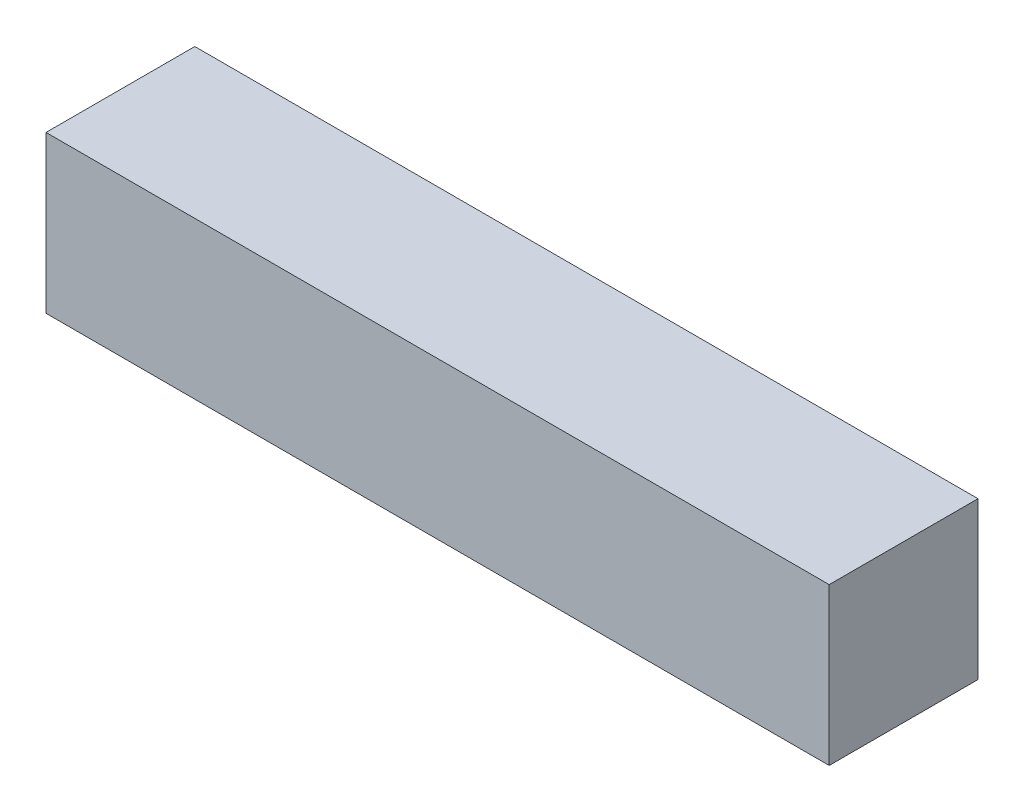
ISO-10303-21;
HEADER;
FILE_DESCRIPTION(('STEP AP214'),'2;1');
FILE_NAME('part.step','',(''),(''),'','','');
FILE_SCHEMA(('AUTOMOTIVE_DESIGN { 1 0 10303 214 1 1 1 1 }'));
ENDSEC;
DATA;
#1=APPLICATION_CONTEXT('core data for automotive mechanical design processes');
#2=APPLICATION_PROTOCOL_DEFINITION('international standard','automotive_design',2000,#1);
#3=PRODUCT_CONTEXT('',#1,'mechanical');
#4=PRODUCT('Part','Part','',(#3));
#5=PRODUCT_RELATED_PRODUCT_CATEGORY('part','',(#4));
#6=PRODUCT_DEFINITION_FORMATION('','',#4);
#7=PRODUCT_DEFINITION_CONTEXT('part definition',#1,'design');
#8=PRODUCT_DEFINITION('design','',#6,#7);
#9=PRODUCT_DEFINITION_SHAPE('','',#8);
#10=(LENGTH_UNIT() NAMED_UNIT(*) SI_UNIT(.MILLI.,.METRE.));
#11=(NAMED_UNIT(*) PLANE_ANGLE_UNIT() SI_UNIT($,.RADIAN.));
#12=(NAMED_UNIT(*) SI_UNIT($,.STERADIAN.) SOLID_ANGLE_UNIT());
#13=UNCERTAINTY_MEASURE_WITH_UNIT(LENGTH_MEASURE(1.E-05),#10,'distance_accuracy_value','');
#14=(GEOMETRIC_REPRESENTATION_CONTEXT(3) GLOBAL_UNCERTAINTY_ASSIGNED_CONTEXT((#13)) GLOBAL_UNIT_ASSIGNED_CONTEXT((#10,
#11,#12)) REPRESENTATION_CONTEXT('',''));
#15=CARTESIAN_POINT('',(0.,0.,0.));
#16=DIRECTION('',(0.,0.,1.));
#17=DIRECTION('',(1.,0.,0.));
#18=AXIS2_PLACEMENT_3D('',#15,#16,#17);
#19=CARTESIAN_POINT('',(-50.,10.,19.));
#20=DIRECTION('',(1.,0.,0.));
#21=DIRECTION('',(0.,0.,-1.));
#22=AXIS2_PLACEMENT_3D('',#19,#20,#21);
#23=PLANE('',#22);
#24=DIRECTION('',(0.,-1.,0.));
#25=VECTOR('',#24,1.);
#26=CARTESIAN_POINT('',(-50.,10.,0.));
#27=LINE('',#26,#25);
#28=CARTESIAN_POINT('',(-50.,10.,0.));
#29=VERTEX_POINT('',#28);
#30=CARTESIAN_POINT('',(-50.,-10.,0.));
#31=VERTEX_POINT('',#30);
#32=EDGE_CURVE('E152',#29,#31,#27,.T.);
#33=ORIENTED_EDGE('',*,*,#32,.T.);
#34=DIRECTION('',(0.,0.,-1.));
#35=VECTOR('',#34,1.);
#36=CARTESIAN_POINT('',(-50.,-10.,19.));
#37=LINE('',#36,#35);
#38=CARTESIAN_POINT('',(-50.,-10.,19.));
#39=VERTEX_POINT('',#38);
#40=EDGE_CURVE('E156',#39,#31,#37,.T.);
#41=ORIENTED_EDGE('',*,*,#40,.F.);
#42=DIRECTION('',(0.,-1.,0.));
#43=VECTOR('',#42,1.);
#44=CARTESIAN_POINT('',(-50.,10.,19.));
#45=LINE('',#44,#43);
#46=CARTESIAN_POINT('',(-50.,10.,19.));
#47=VERTEX_POINT('',#46);
#48=EDGE_CURVE('E143',#47,#39,#45,.T.);
#49=ORIENTED_EDGE('',*,*,#48,.F.);
#50=DIRECTION('',(0.,0.,-1.));
#51=VECTOR('',#50,1.);
#52=CARTESIAN_POINT('',(-50.,10.,19.));
#53=LINE('',#52,#51);
#54=EDGE_CURVE('E45',#47,#29,#53,.T.);
#55=ORIENTED_EDGE('',*,*,#54,.T.);
#56=EDGE_LOOP('',(#33,#41,#49,#55));
#57=FACE_BOUND('',#56,.T.);
#58=ADVANCED_FACE('F36',(#57),#23,.F.);
#59=CARTESIAN_POINT('',(50.,10.,19.));
#60=DIRECTION('',(-1.,0.,0.));
#61=DIRECTION('',(0.,0.,1.));
#62=AXIS2_PLACEMENT_3D('',#59,#60,#61);
#63=PLANE('',#62);
#64=DIRECTION('',(0.,1.,0.));
#65=VECTOR('',#64,1.);
#66=CARTESIAN_POINT('',(50.,10.,0.));
#67=LINE('',#66,#65);
#68=CARTESIAN_POINT('',(50.,-10.,0.));
#69=VERTEX_POINT('',#68);
#70=CARTESIAN_POINT('',(50.,10.,0.));
#71=VERTEX_POINT('',#70);
#72=EDGE_CURVE('E147',#69,#71,#67,.T.);
#73=ORIENTED_EDGE('',*,*,#72,.T.);
#74=DIRECTION('',(0.,0.,-1.));
#75=VECTOR('',#74,1.);
#76=CARTESIAN_POINT('',(50.,10.,19.));
#77=LINE('',#76,#75);
#78=CARTESIAN_POINT('',(50.,10.,19.));
#79=VERTEX_POINT('',#78);
#80=EDGE_CURVE('E11',#79,#71,#77,.T.);
#81=ORIENTED_EDGE('',*,*,#80,.F.);
#82=DIRECTION('',(0.,1.,0.));
#83=VECTOR('',#82,1.);
#84=CARTESIAN_POINT('',(50.,10.,19.));
#85=LINE('',#84,#83);
#86=CARTESIAN_POINT('',(50.,-10.,19.));
#87=VERTEX_POINT('',#86);
#88=EDGE_CURVE('E140',#87,#79,#85,.T.);
#89=ORIENTED_EDGE('',*,*,#88,.F.);
#90=DIRECTION('',(0.,0.,-1.));
#91=VECTOR('',#90,1.);
#92=CARTESIAN_POINT('',(50.,-10.,19.));
#93=LINE('',#92,#91);
#94=EDGE_CURVE('E146',#87,#69,#93,.T.);
#95=ORIENTED_EDGE('',*,*,#94,.T.);
#96=EDGE_LOOP('',(#73,#81,#89,#95));
#97=FACE_BOUND('',#96,.T.);
#98=ADVANCED_FACE('F38',(#97),#63,.F.);
#99=CARTESIAN_POINT('',(-50.,10.,19.));
#100=DIRECTION('',(0.,-1.,0.));
#101=DIRECTION('',(0.,0.,-1.));
#102=AXIS2_PLACEMENT_3D('',#99,#100,#101);
#103=PLANE('',#102);
#104=DIRECTION('',(-1.,0.,0.));
#105=VECTOR('',#104,1.);
#106=CARTESIAN_POINT('',(-50.,10.,0.));
#107=LINE('',#106,#105);
#108=EDGE_CURVE('E150',#71,#29,#107,.T.);
#109=ORIENTED_EDGE('',*,*,#108,.T.);
#110=ORIENTED_EDGE('',*,*,#54,.F.);
#111=DIRECTION('',(-1.,0.,0.));
#112=VECTOR('',#111,1.);
#113=CARTESIAN_POINT('',(-50.,10.,19.));
#114=LINE('',#113,#112);
#115=EDGE_CURVE('E89',#79,#47,#114,.T.);
#116=ORIENTED_EDGE('',*,*,#115,.F.);
#117=ORIENTED_EDGE('',*,*,#80,.T.);
#118=EDGE_LOOP('',(#109,#110,#116,#117));
#119=FACE_BOUND('',#118,.T.);
#120=ADVANCED_FACE('F171',(#119),#103,.F.);
#121=CARTESIAN_POINT('',(-50.,-10.,19.));
#122=DIRECTION('',(0.,1.,0.));
#123=DIRECTION('',(0.,0.,1.));
#124=AXIS2_PLACEMENT_3D('',#121,#122,#123);
#125=PLANE('',#124);
#126=DIRECTION('',(1.,0.,0.));
#127=VECTOR('',#126,1.);
#128=CARTESIAN_POINT('',(-50.,-10.,0.));
#129=LINE('',#128,#127);
#130=EDGE_CURVE('E82',#31,#69,#129,.T.);
#131=ORIENTED_EDGE('',*,*,#130,.T.);
#132=ORIENTED_EDGE('',*,*,#94,.F.);
#133=DIRECTION('',(1.,0.,0.));
#134=VECTOR('',#133,1.);
#135=CARTESIAN_POINT('',(-50.,-10.,19.));
#136=LINE('',#135,#134);
#137=EDGE_CURVE('E61',#39,#87,#136,.T.);
#138=ORIENTED_EDGE('',*,*,#137,.F.);
#139=ORIENTED_EDGE('',*,*,#40,.T.);
#140=EDGE_LOOP('',(#131,#132,#138,#139));
#141=FACE_BOUND('',#140,.T.);
#142=ADVANCED_FACE('F168',(#141),#125,.F.);
#143=CARTESIAN_POINT('',(0.,0.,19.));
#144=DIRECTION('',(0.,0.,1.));
#145=DIRECTION('',(1.,0.,0.));
#146=AXIS2_PLACEMENT_3D('',#143,#144,#145);
#147=PLANE('',#146);
#148=ORIENTED_EDGE('',*,*,#88,.T.);
#149=ORIENTED_EDGE('',*,*,#115,.T.);
#150=ORIENTED_EDGE('',*,*,#48,.T.);
#151=ORIENTED_EDGE('',*,*,#137,.T.);
#152=EDGE_LOOP('',(#148,#149,#150,#151));
#153=FACE_BOUND('',#152,.T.);
#154=ADVANCED_FACE('F170',(#153),#147,.T.);
#155=CARTESIAN_POINT('',(0.,0.,0.));
#156=DIRECTION('',(0.,0.,1.));
#157=DIRECTION('',(1.,0.,0.));
#158=AXIS2_PLACEMENT_3D('',#155,#156,#157);
#159=PLANE('',#158);
#160=ORIENTED_EDGE('',*,*,#72,.F.);
#161=ORIENTED_EDGE('',*,*,#130,.F.);
#162=ORIENTED_EDGE('',*,*,#32,.F.);
#163=ORIENTED_EDGE('',*,*,#108,.F.);
#164=EDGE_LOOP('',(#160,#161,#162,#163));
#165=FACE_BOUND('',#164,.T.);
#166=ADVANCED_FACE('F164',(#165),#159,.F.);
#167=CLOSED_SHELL('',(#58,#98,#120,#142,#154,#166));
#168=CARTESIAN_POINT('',(48.,10.,19.));
#169=DIRECTION('',(-1.,0.,0.));
#170=DIRECTION('',(0.,0.,1.));
#171=AXIS2_PLACEMENT_3D('',#168,#169,#170);
#172=PLANE('',#171);
#173=DIRECTION('',(0.,1.,0.));
#174=VECTOR('',#173,1.);
#175=CARTESIAN_POINT('',(48.,10.,2.));
#176=LINE('',#175,#174);
#177=CARTESIAN_POINT('',(48.,-8.00000000000001,2.));
#178=VERTEX_POINT('',#177);
#179=CARTESIAN_POINT('',(48.,8.00000000000001,2.));
#180=VERTEX_POINT('',#179);
#181=EDGE_CURVE('E279',#178,#180,#176,.T.);
#182=ORIENTED_EDGE('',*,*,#181,.F.);
#183=DIRECTION('',(0.,0.,-1.));
#184=VECTOR('',#183,1.);
#185=CARTESIAN_POINT('',(48.,-8.00000000000002,19.));
#186=LINE('',#185,#184);
#187=CARTESIAN_POINT('',(48.,-8.00000000000001,17.));
#188=VERTEX_POINT('',#187);
#189=EDGE_CURVE('E130',#188,#178,#186,.T.);
#190=ORIENTED_EDGE('',*,*,#189,.F.);
#191=DIRECTION('',(0.,1.,0.));
#192=VECTOR('',#191,1.);
#193=CARTESIAN_POINT('',(48.,10.,17.));
#194=LINE('',#193,#192);
#195=CARTESIAN_POINT('',(48.,8.00000000000001,17.));
#196=VERTEX_POINT('',#195);
#197=EDGE_CURVE('E129',#188,#196,#194,.T.);
#198=ORIENTED_EDGE('',*,*,#197,.T.);
#199=DIRECTION('',(0.,0.,-1.));
#200=VECTOR('',#199,1.);
#201=CARTESIAN_POINT('',(48.,8.00000000000001,19.));
#202=LINE('',#201,#200);
#203=EDGE_CURVE('E133',#196,#180,#202,.T.);
#204=ORIENTED_EDGE('',*,*,#203,.T.);
#205=EDGE_LOOP('',(#182,#190,#198,#204));
#206=FACE_BOUND('',#205,.T.);
#207=ADVANCED_FACE('F214',(#206),#172,.T.);
#208=CARTESIAN_POINT('',(0.,0.,17.));
#209=DIRECTION('',(0.,0.,1.));
#210=DIRECTION('',(1.,0.,0.));
#211=AXIS2_PLACEMENT_3D('',#208,#209,#210);
#212=PLANE('',#211);
#213=DIRECTION('',(0.,1.,0.));
#214=VECTOR('',#213,1.);
#215=CARTESIAN_POINT('',(-48.,8.00000000000001,17.));
#216=LINE('',#215,#214);
#217=CARTESIAN_POINT('',(-48.,-8.00000000000001,17.));
#218=VERTEX_POINT('',#217);
#219=CARTESIAN_POINT('',(-48.,8.00000000000001,17.));
#220=VERTEX_POINT('',#219);
#221=EDGE_CURVE('E109',#218,#220,#216,.T.);
#222=ORIENTED_EDGE('',*,*,#221,.T.);
#223=DIRECTION('',(-1.,0.,0.));
#224=VECTOR('',#223,1.);
#225=CARTESIAN_POINT('',(-50.,8.00000000000001,17.));
#226=LINE('',#225,#224);
#227=EDGE_CURVE('E131',#196,#220,#226,.T.);
#228=ORIENTED_EDGE('',*,*,#227,.F.);
#229=ORIENTED_EDGE('',*,*,#197,.F.);
#230=DIRECTION('',(1.,0.,0.));
#231=VECTOR('',#230,1.);
#232=CARTESIAN_POINT('',(-50.,-8.00000000000001,17.));
#233=LINE('',#232,#231);
#234=EDGE_CURVE('E121',#218,#188,#233,.T.);
#235=ORIENTED_EDGE('',*,*,#234,.F.);
#236=EDGE_LOOP('',(#222,#228,#229,#235));
#237=FACE_BOUND('',#236,.T.);
#238=ADVANCED_FACE('F127',(#237),#212,.F.);
#239=CARTESIAN_POINT('',(0.,0.,2.));
#240=DIRECTION('',(0.,0.,1.));
#241=DIRECTION('',(1.,0.,0.));
#242=AXIS2_PLACEMENT_3D('',#239,#240,#241);
#243=PLANE('',#242);
#244=DIRECTION('',(-1.,0.,0.));
#245=VECTOR('',#244,1.);
#246=CARTESIAN_POINT('',(-50.,8.00000000000001,2.));
#247=LINE('',#246,#245);
#248=CARTESIAN_POINT('',(-48.,8.00000000000001,2.));
#249=VERTEX_POINT('',#248);
#250=EDGE_CURVE('E139',#180,#249,#247,.T.);
#251=ORIENTED_EDGE('',*,*,#250,.T.);
#252=DIRECTION('',(0.,-1.,0.));
#253=VECTOR('',#252,1.);
#254=CARTESIAN_POINT('',(-48.,8.00000000000001,2.));
#255=LINE('',#254,#253);
#256=CARTESIAN_POINT('',(-48.,-8.00000000000001,2.));
#257=VERTEX_POINT('',#256);
#258=EDGE_CURVE('E124',#249,#257,#255,.T.);
#259=ORIENTED_EDGE('',*,*,#258,.T.);
#260=DIRECTION('',(1.,0.,0.));
#261=VECTOR('',#260,1.);
#262=CARTESIAN_POINT('',(-50.,-8.00000000000001,2.));
#263=LINE('',#262,#261);
#264=EDGE_CURVE('E123',#257,#178,#263,.T.);
#265=ORIENTED_EDGE('',*,*,#264,.T.);
#266=ORIENTED_EDGE('',*,*,#181,.T.);
#267=EDGE_LOOP('',(#251,#259,#265,#266));
#268=FACE_BOUND('',#267,.T.);
#269=ADVANCED_FACE('F235',(#268),#243,.T.);
#270=CARTESIAN_POINT('',(-50.,-8.00000000000001,19.));
#271=DIRECTION('',(0.,1.,0.));
#272=DIRECTION('',(0.,0.,1.));
#273=AXIS2_PLACEMENT_3D('',#270,#271,#272);
#274=PLANE('',#273);
#275=ORIENTED_EDGE('',*,*,#264,.F.);
#276=DIRECTION('',(0.,0.,1.));
#277=VECTOR('',#276,1.);
#278=CARTESIAN_POINT('',(-48.,-8.00000000000001,2.));
#279=LINE('',#278,#277);
#280=EDGE_CURVE('E52',#257,#218,#279,.T.);
#281=ORIENTED_EDGE('',*,*,#280,.T.);
#282=ORIENTED_EDGE('',*,*,#234,.T.);
#283=ORIENTED_EDGE('',*,*,#189,.T.);
#284=EDGE_LOOP('',(#275,#281,#282,#283));
#285=FACE_BOUND('',#284,.T.);
#286=ADVANCED_FACE('F119',(#285),#274,.T.);
#287=CARTESIAN_POINT('',(-50.,8.00000000000001,19.));
#288=DIRECTION('',(0.,-1.,0.));
#289=DIRECTION('',(0.,0.,-1.));
#290=AXIS2_PLACEMENT_3D('',#287,#288,#289);
#291=PLANE('',#290);
#292=ORIENTED_EDGE('',*,*,#227,.T.);
#293=DIRECTION('',(0.,0.,-1.));
#294=VECTOR('',#293,1.);
#295=CARTESIAN_POINT('',(-48.,8.00000000000001,2.));
#296=LINE('',#295,#294);
#297=EDGE_CURVE('E112',#220,#249,#296,.T.);
#298=ORIENTED_EDGE('',*,*,#297,.T.);
#299=ORIENTED_EDGE('',*,*,#250,.F.);
#300=ORIENTED_EDGE('',*,*,#203,.F.);
#301=EDGE_LOOP('',(#292,#298,#299,#300));
#302=FACE_BOUND('',#301,.T.);
#303=ADVANCED_FACE('F252',(#302),#291,.T.);
#304=CARTESIAN_POINT('',(-48.,0.,0.));
#305=DIRECTION('',(-1.,0.,0.));
#306=DIRECTION('',(0.,0.,1.));
#307=AXIS2_PLACEMENT_3D('',#304,#305,#306);
#308=PLANE('',#307);
#309=ORIENTED_EDGE('',*,*,#258,.F.);
#310=ORIENTED_EDGE('',*,*,#297,.F.);
#311=ORIENTED_EDGE('',*,*,#221,.F.);
#312=ORIENTED_EDGE('',*,*,#280,.F.);
#313=EDGE_LOOP('',(#309,#310,#311,#312));
#314=FACE_BOUND('',#313,.T.);
#315=ADVANCED_FACE('F110',(#314),#308,.F.);
#316=CLOSED_SHELL('',(#207,#238,#269,#286,#303,#315));
#317=ORIENTED_CLOSED_SHELL('',*,#316,.T.);
#318=BREP_WITH_VOIDS('B2',#167,(#317));
#319=ADVANCED_BREP_SHAPE_REPRESENTATION('',(#18,#318),#14);
#320=SHAPE_DEFINITION_REPRESENTATION(#9,#319);
ENDSEC;
END-ISO-10303-21;
